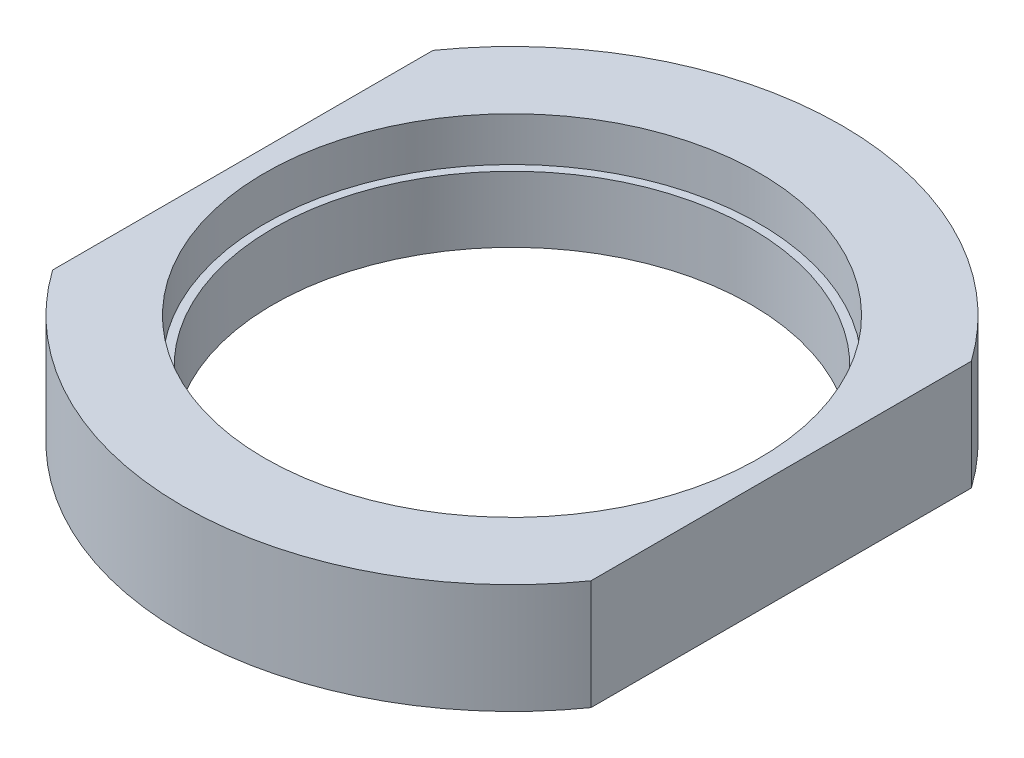
ISO-10303-21;
HEADER;
FILE_DESCRIPTION(('STEP AP214'),'2;1');
FILE_NAME('part.step','',(''),(''),'','','');
FILE_SCHEMA(('AUTOMOTIVE_DESIGN { 1 0 10303 214 1 1 1 1 }'));
ENDSEC;
DATA;
#1=APPLICATION_CONTEXT('core data for automotive mechanical design processes');
#2=APPLICATION_PROTOCOL_DEFINITION('international standard','automotive_design',2000,#1);
#3=PRODUCT_CONTEXT('',#1,'mechanical');
#4=PRODUCT('Part','Part','',(#3));
#5=PRODUCT_RELATED_PRODUCT_CATEGORY('part','',(#4));
#6=PRODUCT_DEFINITION_FORMATION('','',#4);
#7=PRODUCT_DEFINITION_CONTEXT('part definition',#1,'design');
#8=PRODUCT_DEFINITION('design','',#6,#7);
#9=PRODUCT_DEFINITION_SHAPE('','',#8);
#10=(LENGTH_UNIT() NAMED_UNIT(*) SI_UNIT(.MILLI.,.METRE.));
#11=(NAMED_UNIT(*) PLANE_ANGLE_UNIT() SI_UNIT($,.RADIAN.));
#12=(NAMED_UNIT(*) SI_UNIT($,.STERADIAN.) SOLID_ANGLE_UNIT());
#13=UNCERTAINTY_MEASURE_WITH_UNIT(LENGTH_MEASURE(1.E-05),#10,'distance_accuracy_value','');
#14=(GEOMETRIC_REPRESENTATION_CONTEXT(3) GLOBAL_UNCERTAINTY_ASSIGNED_CONTEXT((#13)) GLOBAL_UNIT_ASSIGNED_CONTEXT((#10,
#11,#12)) REPRESENTATION_CONTEXT('',''));
#15=CARTESIAN_POINT('',(0.,0.,0.));
#16=DIRECTION('',(0.,0.,1.));
#17=DIRECTION('',(1.,0.,0.));
#18=AXIS2_PLACEMENT_3D('',#15,#16,#17);
#19=CARTESIAN_POINT('',(0.,20.,0.));
#20=DIRECTION('',(0.,-1.,0.));
#21=DIRECTION('',(0.,0.,-1.));
#22=AXIS2_PLACEMENT_3D('',#19,#20,#21);
#23=CYLINDRICAL_SURFACE('',#22,43.5);
#24=CARTESIAN_POINT('',(0.,0.,0.));
#25=DIRECTION('',(0.,-1.,0.));
#26=DIRECTION('',(0.,0.,-1.));
#27=AXIS2_PLACEMENT_3D('',#24,#25,#26);
#28=CIRCLE('',#27,43.5);
#29=CARTESIAN_POINT('',(0.,0.,-43.5));
#30=VERTEX_POINT('',#29);
#31=EDGE_CURVE('E102',#30,#30,#28,.T.);
#32=ORIENTED_EDGE('',*,*,#31,.T.);
#33=EDGE_LOOP('',(#32));
#34=FACE_BOUND('',#33,.T.);
#35=CARTESIAN_POINT('',(0.,12.,0.));
#36=DIRECTION('',(0.,1.,0.));
#37=DIRECTION('',(0.,0.,1.));
#38=AXIS2_PLACEMENT_3D('',#35,#36,#37);
#39=CIRCLE('',#38,43.5);
#40=CARTESIAN_POINT('',(0.,12.,43.5));
#41=VERTEX_POINT('',#40);
#42=EDGE_CURVE('E37',#41,#41,#39,.F.);
#43=ORIENTED_EDGE('',*,*,#42,.F.);
#44=EDGE_LOOP('',(#43));
#45=FACE_BOUND('',#44,.T.);
#46=ADVANCED_FACE('F33',(#34,#45),#23,.F.);
#47=CARTESIAN_POINT('',(0.,20.,0.));
#48=DIRECTION('',(0.,-1.,0.));
#49=DIRECTION('',(0.,0.,-1.));
#50=AXIS2_PLACEMENT_3D('',#47,#48,#49);
#51=CYLINDRICAL_SURFACE('',#50,60.);
#52=CARTESIAN_POINT('',(0.,0.,0.));
#53=DIRECTION('',(0.,1.,0.));
#54=DIRECTION('',(0.,0.,1.));
#55=AXIS2_PLACEMENT_3D('',#52,#53,#54);
#56=CIRCLE('',#55,60.);
#57=CARTESIAN_POINT('',(49.,0.,-34.6265793863616));
#58=VERTEX_POINT('',#57);
#59=CARTESIAN_POINT('',(-49.,0.,-34.6265793863616));
#60=VERTEX_POINT('',#59);
#61=EDGE_CURVE('E99',#58,#60,#56,.T.);
#62=ORIENTED_EDGE('',*,*,#61,.T.);
#63=DIRECTION('',(0.,-1.,0.));
#64=VECTOR('',#63,1.);
#65=CARTESIAN_POINT('',(-49.,20.,-34.6265793863616));
#66=LINE('',#65,#64);
#67=CARTESIAN_POINT('',(-49.,20.,-34.6265793863616));
#68=VERTEX_POINT('',#67);
#69=EDGE_CURVE('E11',#68,#60,#66,.T.);
#70=ORIENTED_EDGE('',*,*,#69,.F.);
#71=CARTESIAN_POINT('',(0.,20.,0.));
#72=DIRECTION('',(0.,1.,0.));
#73=DIRECTION('',(0.,0.,1.));
#74=AXIS2_PLACEMENT_3D('',#71,#72,#73);
#75=CIRCLE('',#74,60.);
#76=CARTESIAN_POINT('',(49.,20.,-34.6265793863616));
#77=VERTEX_POINT('',#76);
#78=EDGE_CURVE('E86',#77,#68,#75,.T.);
#79=ORIENTED_EDGE('',*,*,#78,.F.);
#80=DIRECTION('',(0.,-1.,0.));
#81=VECTOR('',#80,1.);
#82=CARTESIAN_POINT('',(49.,20.,-34.6265793863616));
#83=LINE('',#82,#81);
#84=EDGE_CURVE('E95',#77,#58,#83,.T.);
#85=ORIENTED_EDGE('',*,*,#84,.T.);
#86=EDGE_LOOP('',(#62,#70,#79,#85));
#87=FACE_BOUND('',#86,.T.);
#88=ADVANCED_FACE('F35',(#87),#51,.T.);
#89=CARTESIAN_POINT('',(-49.,20.,34.6265793863616));
#90=DIRECTION('',(1.,0.,0.));
#91=DIRECTION('',(0.,0.,-1.));
#92=AXIS2_PLACEMENT_3D('',#89,#90,#91);
#93=PLANE('',#92);
#94=DIRECTION('',(0.,0.,1.));
#95=VECTOR('',#94,1.);
#96=CARTESIAN_POINT('',(-49.,0.,34.6265793863616));
#97=LINE('',#96,#95);
#98=CARTESIAN_POINT('',(-49.,0.,34.6265793863616));
#99=VERTEX_POINT('',#98);
#100=EDGE_CURVE('E90',#60,#99,#97,.T.);
#101=ORIENTED_EDGE('',*,*,#100,.T.);
#102=DIRECTION('',(0.,-1.,0.));
#103=VECTOR('',#102,1.);
#104=CARTESIAN_POINT('',(-49.,20.,34.6265793863616));
#105=LINE('',#104,#103);
#106=CARTESIAN_POINT('',(-49.,20.,34.6265793863616));
#107=VERTEX_POINT('',#106);
#108=EDGE_CURVE('E43',#107,#99,#105,.T.);
#109=ORIENTED_EDGE('',*,*,#108,.F.);
#110=DIRECTION('',(0.,0.,1.));
#111=VECTOR('',#110,1.);
#112=CARTESIAN_POINT('',(-49.,20.,34.6265793863616));
#113=LINE('',#112,#111);
#114=EDGE_CURVE('E81',#68,#107,#113,.T.);
#115=ORIENTED_EDGE('',*,*,#114,.F.);
#116=ORIENTED_EDGE('',*,*,#69,.T.);
#117=EDGE_LOOP('',(#101,#109,#115,#116));
#118=FACE_BOUND('',#117,.T.);
#119=ADVANCED_FACE('F89',(#118),#93,.F.);
#120=CARTESIAN_POINT('',(0.,20.,0.));
#121=DIRECTION('',(0.,-1.,0.));
#122=DIRECTION('',(0.,0.,-1.));
#123=AXIS2_PLACEMENT_3D('',#120,#121,#122);
#124=CYLINDRICAL_SURFACE('',#123,60.);
#125=CARTESIAN_POINT('',(0.,0.,0.));
#126=DIRECTION('',(0.,1.,0.));
#127=DIRECTION('',(0.,0.,1.));
#128=AXIS2_PLACEMENT_3D('',#125,#126,#127);
#129=CIRCLE('',#128,60.);
#130=CARTESIAN_POINT('',(49.,0.,34.6265793863615));
#131=VERTEX_POINT('',#130);
#132=EDGE_CURVE('E68',#99,#131,#129,.T.);
#133=ORIENTED_EDGE('',*,*,#132,.T.);
#134=DIRECTION('',(0.,-1.,0.));
#135=VECTOR('',#134,1.);
#136=CARTESIAN_POINT('',(49.,20.,34.6265793863615));
#137=LINE('',#136,#135);
#138=CARTESIAN_POINT('',(49.,20.,34.6265793863615));
#139=VERTEX_POINT('',#138);
#140=EDGE_CURVE('E91',#139,#131,#137,.T.);
#141=ORIENTED_EDGE('',*,*,#140,.F.);
#142=CARTESIAN_POINT('',(0.,20.,0.));
#143=DIRECTION('',(0.,1.,0.));
#144=DIRECTION('',(0.,0.,1.));
#145=AXIS2_PLACEMENT_3D('',#142,#143,#144);
#146=CIRCLE('',#145,60.);
#147=EDGE_CURVE('E84',#107,#139,#146,.T.);
#148=ORIENTED_EDGE('',*,*,#147,.F.);
#149=ORIENTED_EDGE('',*,*,#108,.T.);
#150=EDGE_LOOP('',(#133,#141,#148,#149));
#151=FACE_BOUND('',#150,.T.);
#152=ADVANCED_FACE('F93',(#151),#124,.T.);
#153=CARTESIAN_POINT('',(49.,20.,34.6265793863615));
#154=DIRECTION('',(-1.,0.,0.));
#155=DIRECTION('',(0.,0.,1.));
#156=AXIS2_PLACEMENT_3D('',#153,#154,#155);
#157=PLANE('',#156);
#158=DIRECTION('',(0.,0.,-1.));
#159=VECTOR('',#158,1.);
#160=CARTESIAN_POINT('',(49.,0.,34.6265793863615));
#161=LINE('',#160,#159);
#162=EDGE_CURVE('E74',#131,#58,#161,.T.);
#163=ORIENTED_EDGE('',*,*,#162,.T.);
#164=ORIENTED_EDGE('',*,*,#84,.F.);
#165=DIRECTION('',(0.,0.,-1.));
#166=VECTOR('',#165,1.);
#167=CARTESIAN_POINT('',(49.,20.,34.6265793863615));
#168=LINE('',#167,#166);
#169=EDGE_CURVE('E51',#139,#77,#168,.T.);
#170=ORIENTED_EDGE('',*,*,#169,.F.);
#171=ORIENTED_EDGE('',*,*,#140,.T.);
#172=EDGE_LOOP('',(#163,#164,#170,#171));
#173=FACE_BOUND('',#172,.T.);
#174=ADVANCED_FACE('F107',(#173),#157,.F.);
#175=CARTESIAN_POINT('',(0.,20.,0.));
#176=DIRECTION('',(0.,1.,0.));
#177=DIRECTION('',(0.,0.,1.));
#178=AXIS2_PLACEMENT_3D('',#175,#176,#177);
#179=PLANE('',#178);
#180=CARTESIAN_POINT('',(0.,20.,0.));
#181=DIRECTION('',(0.,1.,0.));
#182=DIRECTION('',(0.,0.,1.));
#183=AXIS2_PLACEMENT_3D('',#180,#181,#182);
#184=CIRCLE('',#183,45.);
#185=CARTESIAN_POINT('',(0.,20.,45.));
#186=VERTEX_POINT('',#185);
#187=EDGE_CURVE('E115',#186,#186,#184,.T.);
#188=ORIENTED_EDGE('',*,*,#187,.F.);
#189=EDGE_LOOP('',(#188));
#190=FACE_BOUND('',#189,.T.);
#191=ORIENTED_EDGE('',*,*,#78,.T.);
#192=ORIENTED_EDGE('',*,*,#114,.T.);
#193=ORIENTED_EDGE('',*,*,#147,.T.);
#194=ORIENTED_EDGE('',*,*,#169,.T.);
#195=EDGE_LOOP('',(#191,#192,#193,#194));
#196=FACE_BOUND('',#195,.T.);
#197=ADVANCED_FACE('F82',(#190,#196),#179,.T.);
#198=CARTESIAN_POINT('',(0.,0.,0.));
#199=DIRECTION('',(0.,1.,0.));
#200=DIRECTION('',(0.,0.,1.));
#201=AXIS2_PLACEMENT_3D('',#198,#199,#200);
#202=PLANE('',#201);
#203=ORIENTED_EDGE('',*,*,#31,.F.);
#204=EDGE_LOOP('',(#203));
#205=FACE_BOUND('',#204,.T.);
#206=ORIENTED_EDGE('',*,*,#61,.F.);
#207=ORIENTED_EDGE('',*,*,#162,.F.);
#208=ORIENTED_EDGE('',*,*,#132,.F.);
#209=ORIENTED_EDGE('',*,*,#100,.F.);
#210=EDGE_LOOP('',(#206,#207,#208,#209));
#211=FACE_BOUND('',#210,.T.);
#212=ADVANCED_FACE('F110',(#205,#211),#202,.F.);
#213=CARTESIAN_POINT('',(0.,12.,0.));
#214=DIRECTION('',(0.,1.,0.));
#215=DIRECTION('',(0.,0.,1.));
#216=AXIS2_PLACEMENT_3D('',#213,#214,#215);
#217=PLANE('',#216);
#218=CARTESIAN_POINT('',(0.,12.,0.));
#219=DIRECTION('',(0.,1.,0.));
#220=DIRECTION('',(0.,0.,1.));
#221=AXIS2_PLACEMENT_3D('',#218,#219,#220);
#222=CIRCLE('',#221,45.);
#223=CARTESIAN_POINT('',(0.,12.,45.));
#224=VERTEX_POINT('',#223);
#225=EDGE_CURVE('E118',#224,#224,#222,.T.);
#226=ORIENTED_EDGE('',*,*,#225,.T.);
#227=EDGE_LOOP('',(#226));
#228=FACE_BOUND('',#227,.T.);
#229=ORIENTED_EDGE('',*,*,#42,.T.);
#230=EDGE_LOOP('',(#229));
#231=FACE_BOUND('',#230,.T.);
#232=ADVANCED_FACE('F125',(#228,#231),#217,.T.);
#233=CARTESIAN_POINT('',(0.,12.,0.));
#234=DIRECTION('',(0.,1.,0.));
#235=DIRECTION('',(0.,0.,1.));
#236=AXIS2_PLACEMENT_3D('',#233,#234,#235);
#237=CYLINDRICAL_SURFACE('',#236,45.);
#238=ORIENTED_EDGE('',*,*,#225,.F.);
#239=EDGE_LOOP('',(#238));
#240=FACE_BOUND('',#239,.T.);
#241=ORIENTED_EDGE('',*,*,#187,.T.);
#242=EDGE_LOOP('',(#241));
#243=FACE_BOUND('',#242,.T.);
#244=ADVANCED_FACE('F135',(#240,#243),#237,.F.);
#245=CLOSED_SHELL('',(#46,#88,#119,#152,#174,#197,#212,#232,#244));
#246=MANIFOLD_SOLID_BREP('B2',#245);
#247=ADVANCED_BREP_SHAPE_REPRESENTATION('',(#18,#246),#14);
#248=SHAPE_DEFINITION_REPRESENTATION(#9,#247);
ENDSEC;
END-ISO-10303-21;
